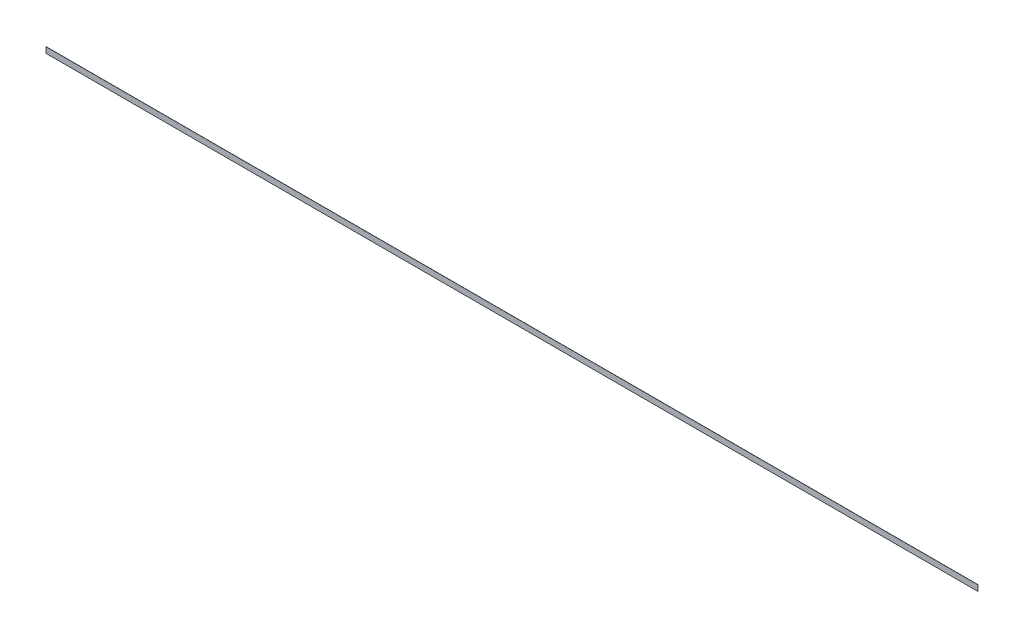
ISO-10303-21;
HEADER;
FILE_DESCRIPTION(('STEP AP214'),'2;1');
FILE_NAME('part.step','',(''),(''),'','','');
FILE_SCHEMA(('AUTOMOTIVE_DESIGN { 1 0 10303 214 1 1 1 1 }'));
ENDSEC;
DATA;
#1=APPLICATION_CONTEXT('core data for automotive mechanical design processes');
#2=APPLICATION_PROTOCOL_DEFINITION('international standard','automotive_design',2000,#1);
#3=PRODUCT_CONTEXT('',#1,'mechanical');
#4=PRODUCT('Part','Part','',(#3));
#5=PRODUCT_RELATED_PRODUCT_CATEGORY('part','',(#4));
#6=PRODUCT_DEFINITION_FORMATION('','',#4);
#7=PRODUCT_DEFINITION_CONTEXT('part definition',#1,'design');
#8=PRODUCT_DEFINITION('design','',#6,#7);
#9=PRODUCT_DEFINITION_SHAPE('','',#8);
#10=(LENGTH_UNIT() NAMED_UNIT(*) SI_UNIT(.MILLI.,.METRE.));
#11=(NAMED_UNIT(*) PLANE_ANGLE_UNIT() SI_UNIT($,.RADIAN.));
#12=(NAMED_UNIT(*) SI_UNIT($,.STERADIAN.) SOLID_ANGLE_UNIT());
#13=UNCERTAINTY_MEASURE_WITH_UNIT(LENGTH_MEASURE(1.E-05),#10,'distance_accuracy_value','');
#14=(GEOMETRIC_REPRESENTATION_CONTEXT(3) GLOBAL_UNCERTAINTY_ASSIGNED_CONTEXT((#13)) GLOBAL_UNIT_ASSIGNED_CONTEXT((#10,
#11,#12)) REPRESENTATION_CONTEXT('',''));
#15=CARTESIAN_POINT('',(0.,0.,0.));
#16=DIRECTION('',(0.,0.,1.));
#17=DIRECTION('',(1.,0.,0.));
#18=AXIS2_PLACEMENT_3D('',#15,#16,#17);
#19=CARTESIAN_POINT('',(-4114.8,-279.4,0.));
#20=DIRECTION('',(0.,0.,1.));
#21=DIRECTION('',(1.,0.,0.));
#22=AXIS2_PLACEMENT_3D('',#19,#20,#21);
#23=PLANE('',#22);
#24=DIRECTION('',(0.,1.,0.));
#25=VECTOR('',#24,1.);
#26=CARTESIAN_POINT('',(-8229.6,-279.4,0.));
#27=LINE('',#26,#25);
#28=CARTESIAN_POINT('',(-8229.6,-304.8,0.));
#29=VERTEX_POINT('',#28);
#30=CARTESIAN_POINT('',(-8229.6,-254.,0.));
#31=VERTEX_POINT('',#30);
#32=EDGE_CURVE('E20',#29,#31,#27,.T.);
#33=ORIENTED_EDGE('',*,*,#32,.T.);
#34=DIRECTION('',(1.,0.,0.));
#35=VECTOR('',#34,1.);
#36=CARTESIAN_POINT('',(-4114.8,-254.,0.));
#37=LINE('',#36,#35);
#38=CARTESIAN_POINT('',(0.,-254.,0.));
#39=VERTEX_POINT('',#38);
#40=EDGE_CURVE('E79',#31,#39,#37,.T.);
#41=ORIENTED_EDGE('',*,*,#40,.T.);
#42=DIRECTION('',(0.,1.,0.));
#43=VECTOR('',#42,1.);
#44=CARTESIAN_POINT('',(0.,-279.4,0.));
#45=LINE('',#44,#43);
#46=CARTESIAN_POINT('',(0.,-304.8,0.));
#47=VERTEX_POINT('',#46);
#48=EDGE_CURVE('E68',#47,#39,#45,.T.);
#49=ORIENTED_EDGE('',*,*,#48,.F.);
#50=DIRECTION('',(1.,0.,0.));
#51=VECTOR('',#50,1.);
#52=CARTESIAN_POINT('',(-4114.8,-304.8,0.));
#53=LINE('',#52,#51);
#54=EDGE_CURVE('E56',#29,#47,#53,.T.);
#55=ORIENTED_EDGE('',*,*,#54,.F.);
#56=EDGE_LOOP('',(#33,#41,#49,#55));
#57=FACE_BOUND('',#56,.T.);
#58=ADVANCED_FACE('F17',(#57),#23,.F.);
#59=CARTESIAN_POINT('',(-8229.6,-279.4,0.396875));
#60=DIRECTION('',(1.,0.,0.));
#61=DIRECTION('',(0.,0.,-1.));
#62=AXIS2_PLACEMENT_3D('',#59,#60,#61);
#63=PLANE('',#62);
#64=DIRECTION('',(0.,1.,0.));
#65=VECTOR('',#64,1.);
#66=CARTESIAN_POINT('',(-8229.6,-279.4,1.577975));
#67=LINE('',#66,#65);
#68=CARTESIAN_POINT('',(-8229.6,-254.,1.577975));
#69=VERTEX_POINT('',#68);
#70=CARTESIAN_POINT('',(-8229.6,-304.8,1.577975));
#71=VERTEX_POINT('',#70);
#72=EDGE_CURVE('E83',#69,#71,#67,.F.);
#73=ORIENTED_EDGE('',*,*,#72,.F.);
#74=DIRECTION('',(0.,0.,1.));
#75=VECTOR('',#74,1.);
#76=CARTESIAN_POINT('',(-8229.6,-254.000000000001,0.396875));
#77=LINE('',#76,#75);
#78=EDGE_CURVE('E65',#69,#31,#77,.F.);
#79=ORIENTED_EDGE('',*,*,#78,.T.);
#80=ORIENTED_EDGE('',*,*,#32,.F.);
#81=DIRECTION('',(0.,0.,1.));
#82=VECTOR('',#81,1.);
#83=CARTESIAN_POINT('',(-8229.6,-304.8,0.396875));
#84=LINE('',#83,#82);
#85=EDGE_CURVE('E62',#71,#29,#84,.F.);
#86=ORIENTED_EDGE('',*,*,#85,.F.);
#87=EDGE_LOOP('',(#73,#79,#80,#86));
#88=FACE_BOUND('',#87,.T.);
#89=ADVANCED_FACE('F61',(#88),#63,.F.);
#90=CARTESIAN_POINT('',(-4114.8,-304.8,0.396875));
#91=DIRECTION('',(0.,-1.,0.));
#92=DIRECTION('',(1.,0.,0.));
#93=AXIS2_PLACEMENT_3D('',#90,#91,#92);
#94=PLANE('',#93);
#95=ORIENTED_EDGE('',*,*,#54,.T.);
#96=DIRECTION('',(0.,0.,-1.));
#97=VECTOR('',#96,1.);
#98=CARTESIAN_POINT('',(0.,-304.8,0.396875));
#99=LINE('',#98,#97);
#100=CARTESIAN_POINT('',(0.,-304.8,1.577975));
#101=VERTEX_POINT('',#100);
#102=EDGE_CURVE('E70',#101,#47,#99,.T.);
#103=ORIENTED_EDGE('',*,*,#102,.F.);
#104=DIRECTION('',(1.,0.,0.));
#105=VECTOR('',#104,1.);
#106=CARTESIAN_POINT('',(-4114.8,-304.8,1.577975));
#107=LINE('',#106,#105);
#108=EDGE_CURVE('E74',#71,#101,#107,.T.);
#109=ORIENTED_EDGE('',*,*,#108,.F.);
#110=ORIENTED_EDGE('',*,*,#85,.T.);
#111=EDGE_LOOP('',(#95,#103,#109,#110));
#112=FACE_BOUND('',#111,.T.);
#113=ADVANCED_FACE('F72',(#112),#94,.T.);
#114=CARTESIAN_POINT('',(0.,-279.4,0.396875));
#115=DIRECTION('',(1.,0.,0.));
#116=DIRECTION('',(0.,0.,-1.));
#117=AXIS2_PLACEMENT_3D('',#114,#115,#116);
#118=PLANE('',#117);
#119=ORIENTED_EDGE('',*,*,#48,.T.);
#120=DIRECTION('',(0.,0.,1.));
#121=VECTOR('',#120,1.);
#122=CARTESIAN_POINT('',(0.,-254.,0.396875));
#123=LINE('',#122,#121);
#124=CARTESIAN_POINT('',(0.,-254.,1.577975));
#125=VERTEX_POINT('',#124);
#126=EDGE_CURVE('E35',#39,#125,#123,.T.);
#127=ORIENTED_EDGE('',*,*,#126,.T.);
#128=DIRECTION('',(0.,1.,0.));
#129=VECTOR('',#128,1.);
#130=CARTESIAN_POINT('',(0.,-279.4,1.577975));
#131=LINE('',#130,#129);
#132=EDGE_CURVE('E26',#101,#125,#131,.T.);
#133=ORIENTED_EDGE('',*,*,#132,.F.);
#134=ORIENTED_EDGE('',*,*,#102,.T.);
#135=EDGE_LOOP('',(#119,#127,#133,#134));
#136=FACE_BOUND('',#135,.T.);
#137=ADVANCED_FACE('F89',(#136),#118,.T.);
#138=CARTESIAN_POINT('',(-4114.8,-254.,0.396875));
#139=DIRECTION('',(0.,-1.,0.));
#140=DIRECTION('',(1.,0.,0.));
#141=AXIS2_PLACEMENT_3D('',#138,#139,#140);
#142=PLANE('',#141);
#143=DIRECTION('',(1.,0.,0.));
#144=VECTOR('',#143,1.);
#145=CARTESIAN_POINT('',(-4114.8,-254.,1.577975));
#146=LINE('',#145,#144);
#147=EDGE_CURVE('E11',#125,#69,#146,.F.);
#148=ORIENTED_EDGE('',*,*,#147,.F.);
#149=ORIENTED_EDGE('',*,*,#126,.F.);
#150=ORIENTED_EDGE('',*,*,#40,.F.);
#151=ORIENTED_EDGE('',*,*,#78,.F.);
#152=EDGE_LOOP('',(#148,#149,#150,#151));
#153=FACE_BOUND('',#152,.T.);
#154=ADVANCED_FACE('F91',(#153),#142,.F.);
#155=CARTESIAN_POINT('',(-4114.8,-279.4,1.577975));
#156=DIRECTION('',(0.,0.,1.));
#157=DIRECTION('',(1.,0.,0.));
#158=AXIS2_PLACEMENT_3D('',#155,#156,#157);
#159=PLANE('',#158);
#160=ORIENTED_EDGE('',*,*,#132,.T.);
#161=ORIENTED_EDGE('',*,*,#147,.T.);
#162=ORIENTED_EDGE('',*,*,#72,.T.);
#163=ORIENTED_EDGE('',*,*,#108,.T.);
#164=EDGE_LOOP('',(#160,#161,#162,#163));
#165=FACE_BOUND('',#164,.T.);
#166=ADVANCED_FACE('F88',(#165),#159,.T.);
#167=CLOSED_SHELL('',(#58,#89,#113,#137,#154,#166));
#168=MANIFOLD_SOLID_BREP('B1',#167);
#169=ADVANCED_BREP_SHAPE_REPRESENTATION('',(#18,#168),#14);
#170=SHAPE_DEFINITION_REPRESENTATION(#9,#169);
ENDSEC;
END-ISO-10303-21;
